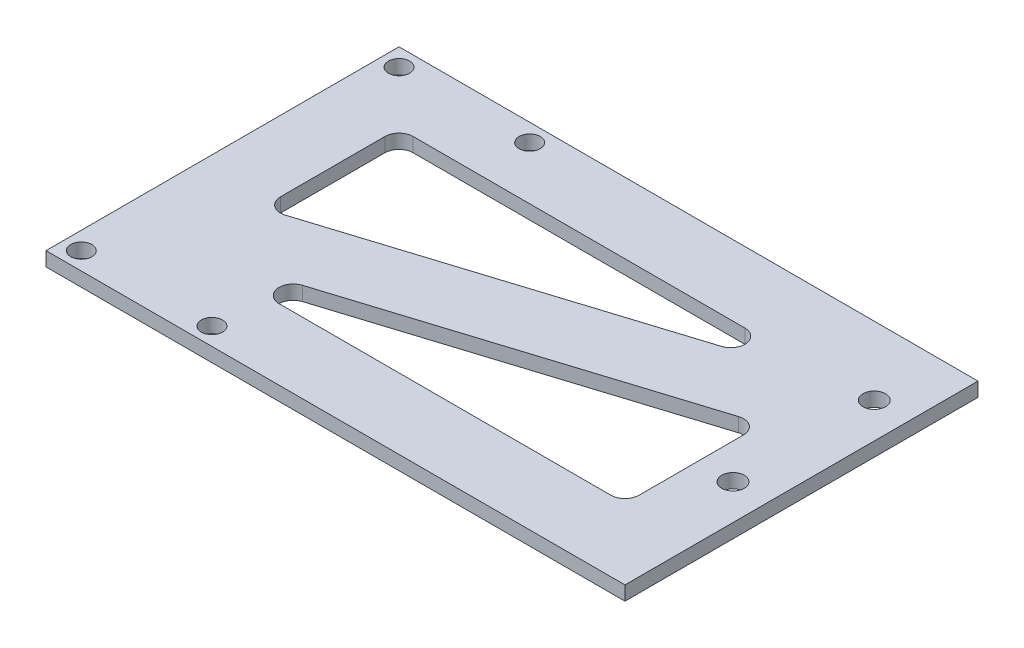
ISO-10303-21;
HEADER;
FILE_DESCRIPTION(('STEP AP214'),'2;1');
FILE_NAME('part.step','',(''),(''),'','','');
FILE_SCHEMA(('AUTOMOTIVE_DESIGN { 1 0 10303 214 1 1 1 1 }'));
ENDSEC;
DATA;
#1=APPLICATION_CONTEXT('core data for automotive mechanical design processes');
#2=APPLICATION_PROTOCOL_DEFINITION('international standard','automotive_design',2000,#1);
#3=PRODUCT_CONTEXT('',#1,'mechanical');
#4=PRODUCT('Part','Part','',(#3));
#5=PRODUCT_RELATED_PRODUCT_CATEGORY('part','',(#4));
#6=PRODUCT_DEFINITION_FORMATION('','',#4);
#7=PRODUCT_DEFINITION_CONTEXT('part definition',#1,'design');
#8=PRODUCT_DEFINITION('design','',#6,#7);
#9=PRODUCT_DEFINITION_SHAPE('','',#8);
#10=(LENGTH_UNIT() NAMED_UNIT(*) SI_UNIT(.MILLI.,.METRE.));
#11=(NAMED_UNIT(*) PLANE_ANGLE_UNIT() SI_UNIT($,.RADIAN.));
#12=(NAMED_UNIT(*) SI_UNIT($,.STERADIAN.) SOLID_ANGLE_UNIT());
#13=UNCERTAINTY_MEASURE_WITH_UNIT(LENGTH_MEASURE(1.E-05),#10,'distance_accuracy_value','');
#14=(GEOMETRIC_REPRESENTATION_CONTEXT(3) GLOBAL_UNCERTAINTY_ASSIGNED_CONTEXT((#13)) GLOBAL_UNIT_ASSIGNED_CONTEXT((#10,
#11,#12)) REPRESENTATION_CONTEXT('',''));
#15=CARTESIAN_POINT('',(0.,0.,0.));
#16=DIRECTION('',(0.,0.,1.));
#17=DIRECTION('',(1.,0.,0.));
#18=AXIS2_PLACEMENT_3D('',#15,#16,#17);
#19=CARTESIAN_POINT('',(0.,2.,0.));
#20=DIRECTION('',(0.,-1.,0.));
#21=DIRECTION('',(0.,0.,-1.));
#22=AXIS2_PLACEMENT_3D('',#19,#20,#21);
#23=PLANE('',#22);
#24=DIRECTION('',(-1.,0.,0.));
#25=VECTOR('',#24,1.);
#26=CARTESIAN_POINT('',(10.,2.,-40.));
#27=LINE('',#26,#25);
#28=CARTESIAN_POINT('',(58.9853099850397,2.,-40.));
#29=VERTEX_POINT('',#28);
#30=CARTESIAN_POINT('',(12.,2.,-40.));
#31=VERTEX_POINT('',#30);
#32=EDGE_CURVE('E386',#29,#31,#27,.T.);
#33=ORIENTED_EDGE('',*,*,#32,.F.);
#34=CARTESIAN_POINT('',(58.9853099850397,2.,-38.));
#35=DIRECTION('',(0.,-1.,0.));
#36=DIRECTION('',(0.,0.,-1.));
#37=AXIS2_PLACEMENT_3D('',#34,#35,#36);
#38=CIRCLE('',#37,2.);
#39=CARTESIAN_POINT('',(59.5858188402202,2.,-36.0922816992937));
#40=VERTEX_POINT('',#39);
#41=EDGE_CURVE('E220',#29,#40,#38,.T.);
#42=ORIENTED_EDGE('',*,*,#41,.T.);
#43=DIRECTION('',(0.953859150353162,0.,-0.30025442759024));
#44=VECTOR('',#43,1.);
#45=CARTESIAN_POINT('',(72.,2.,-40.));
#46=LINE('',#45,#44);
#47=CARTESIAN_POINT('',(12.6005088551805,2.,-21.3023126042917));
#48=VERTEX_POINT('',#47);
#49=EDGE_CURVE('E246',#48,#40,#46,.T.);
#50=ORIENTED_EDGE('',*,*,#49,.F.);
#51=CARTESIAN_POINT('',(12.,2.,-23.2100309049981));
#52=DIRECTION('',(0.,-1.,0.));
#53=DIRECTION('',(0.,0.,-1.));
#54=AXIS2_PLACEMENT_3D('',#51,#52,#53);
#55=CIRCLE('',#54,2.);
#56=CARTESIAN_POINT('',(10.,2.,-23.2100309049981));
#57=VERTEX_POINT('',#56);
#58=EDGE_CURVE('E222',#48,#57,#55,.T.);
#59=ORIENTED_EDGE('',*,*,#58,.T.);
#60=DIRECTION('',(0.,0.,1.));
#61=VECTOR('',#60,1.);
#62=CARTESIAN_POINT('',(10.,2.,-20.4837281230646));
#63=LINE('',#62,#61);
#64=CARTESIAN_POINT('',(10.,2.,-38.));
#65=VERTEX_POINT('',#64);
#66=EDGE_CURVE('E403',#65,#57,#63,.T.);
#67=ORIENTED_EDGE('',*,*,#66,.F.);
#68=CARTESIAN_POINT('',(12.,2.,-38.));
#69=DIRECTION('',(0.,-1.,0.));
#70=DIRECTION('',(0.,0.,-1.));
#71=AXIS2_PLACEMENT_3D('',#68,#69,#70);
#72=CIRCLE('',#71,2.);
#73=EDGE_CURVE('E213',#65,#31,#72,.T.);
#74=ORIENTED_EDGE('',*,*,#73,.T.);
#75=EDGE_LOOP('',(#33,#42,#50,#59,#67,#74));
#76=FACE_BOUND('',#75,.T.);
#77=DIRECTION('',(1.,0.,0.));
#78=VECTOR('',#77,1.);
#79=CARTESIAN_POINT('',(10.,2.,-10.));
#80=LINE('',#79,#78);
#81=CARTESIAN_POINT('',(23.0146900149604,2.,-10.));
#82=VERTEX_POINT('',#81);
#83=CARTESIAN_POINT('',(70.,2.,-10.));
#84=VERTEX_POINT('',#83);
#85=EDGE_CURVE('E236',#82,#84,#80,.T.);
#86=ORIENTED_EDGE('',*,*,#85,.F.);
#87=CARTESIAN_POINT('',(23.0146900149604,2.,-12.));
#88=DIRECTION('',(0.,-1.,0.));
#89=DIRECTION('',(0.,0.,-1.));
#90=AXIS2_PLACEMENT_3D('',#87,#88,#89);
#91=CIRCLE('',#90,2.);
#92=CARTESIAN_POINT('',(22.4141811597799,2.,-13.9077183007063));
#93=VERTEX_POINT('',#92);
#94=EDGE_CURVE('E47',#82,#93,#91,.T.);
#95=ORIENTED_EDGE('',*,*,#94,.T.);
#96=DIRECTION('',(-0.953859150353162,0.,0.30025442759024));
#97=VECTOR('',#96,1.);
#98=CARTESIAN_POINT('',(72.,2.,-29.5162718769354));
#99=LINE('',#98,#97);
#100=CARTESIAN_POINT('',(69.3994911448195,2.,-28.6976873957083));
#101=VERTEX_POINT('',#100);
#102=EDGE_CURVE('E240',#101,#93,#99,.T.);
#103=ORIENTED_EDGE('',*,*,#102,.F.);
#104=CARTESIAN_POINT('',(70.,2.,-26.7899690950019));
#105=DIRECTION('',(0.,-1.,0.));
#106=DIRECTION('',(0.,0.,-1.));
#107=AXIS2_PLACEMENT_3D('',#104,#105,#106);
#108=CIRCLE('',#107,2.);
#109=CARTESIAN_POINT('',(72.,2.,-26.7899690950019));
#110=VERTEX_POINT('',#109);
#111=EDGE_CURVE('E223',#101,#110,#108,.T.);
#112=ORIENTED_EDGE('',*,*,#111,.T.);
#113=DIRECTION('',(0.,0.,-1.));
#114=VECTOR('',#113,1.);
#115=CARTESIAN_POINT('',(72.,2.,-10.));
#116=LINE('',#115,#114);
#117=CARTESIAN_POINT('',(72.,2.,-12.));
#118=VERTEX_POINT('',#117);
#119=EDGE_CURVE('E260',#118,#110,#116,.T.);
#120=ORIENTED_EDGE('',*,*,#119,.F.);
#121=CARTESIAN_POINT('',(70.,2.,-12.));
#122=DIRECTION('',(0.,-1.,0.));
#123=DIRECTION('',(0.,0.,-1.));
#124=AXIS2_PLACEMENT_3D('',#121,#122,#123);
#125=CIRCLE('',#124,2.);
#126=EDGE_CURVE('E227',#118,#84,#125,.T.);
#127=ORIENTED_EDGE('',*,*,#126,.T.);
#128=EDGE_LOOP('',(#86,#95,#103,#112,#120,#127));
#129=FACE_BOUND('',#128,.T.);
#130=CARTESIAN_POINT('',(77.,2.,-20.3));
#131=DIRECTION('',(0.,1.,0.));
#132=DIRECTION('',(0.,0.,1.));
#133=AXIS2_PLACEMENT_3D('',#130,#131,#132);
#134=CIRCLE('',#133,1.6);
#135=CARTESIAN_POINT('',(77.,2.,-18.7));
#136=VERTEX_POINT('',#135);
#137=EDGE_CURVE('E268',#136,#136,#134,.T.);
#138=ORIENTED_EDGE('',*,*,#137,.F.);
#139=EDGE_LOOP('',(#138));
#140=FACE_BOUND('',#139,.T.);
#141=CARTESIAN_POINT('',(77.,2.,-40.3));
#142=DIRECTION('',(0.,1.,0.));
#143=DIRECTION('',(0.,0.,1.));
#144=AXIS2_PLACEMENT_3D('',#141,#142,#143);
#145=CIRCLE('',#144,1.60000000000001);
#146=CARTESIAN_POINT('',(77.,2.,-38.7));
#147=VERTEX_POINT('',#146);
#148=EDGE_CURVE('E271',#147,#147,#145,.T.);
#149=ORIENTED_EDGE('',*,*,#148,.F.);
#150=EDGE_LOOP('',(#149));
#151=FACE_BOUND('',#150,.T.);
#152=DIRECTION('',(0.,0.,1.));
#153=VECTOR('',#152,1.);
#154=CARTESIAN_POINT('',(0.,2.,0.));
#155=LINE('',#154,#153);
#156=CARTESIAN_POINT('',(0.,2.,-50.));
#157=VERTEX_POINT('',#156);
#158=CARTESIAN_POINT('',(0.,2.,0.));
#159=VERTEX_POINT('',#158);
#160=EDGE_CURVE('E164',#157,#159,#155,.T.);
#161=ORIENTED_EDGE('',*,*,#160,.T.);
#162=DIRECTION('',(1.,0.,0.));
#163=VECTOR('',#162,1.);
#164=CARTESIAN_POINT('',(0.,2.,0.));
#165=LINE('',#164,#163);
#166=CARTESIAN_POINT('',(82.,2.,0.));
#167=VERTEX_POINT('',#166);
#168=EDGE_CURVE('E152',#159,#167,#165,.T.);
#169=ORIENTED_EDGE('',*,*,#168,.T.);
#170=DIRECTION('',(0.,0.,-1.));
#171=VECTOR('',#170,1.);
#172=CARTESIAN_POINT('',(82.,2.,0.));
#173=LINE('',#172,#171);
#174=CARTESIAN_POINT('',(82.,2.,-50.));
#175=VERTEX_POINT('',#174);
#176=EDGE_CURVE('E163',#167,#175,#173,.T.);
#177=ORIENTED_EDGE('',*,*,#176,.T.);
#178=DIRECTION('',(-1.,0.,0.));
#179=VECTOR('',#178,1.);
#180=CARTESIAN_POINT('',(0.,2.,-50.));
#181=LINE('',#180,#179);
#182=EDGE_CURVE('E168',#175,#157,#181,.T.);
#183=ORIENTED_EDGE('',*,*,#182,.T.);
#184=EDGE_LOOP('',(#161,#169,#177,#183));
#185=FACE_BOUND('',#184,.T.);
#186=CARTESIAN_POINT('',(2.5,2.,-47.5));
#187=DIRECTION('',(0.,1.,0.));
#188=DIRECTION('',(0.,0.,1.));
#189=AXIS2_PLACEMENT_3D('',#186,#187,#188);
#190=CIRCLE('',#189,1.5);
#191=CARTESIAN_POINT('',(2.5,2.,-46.));
#192=VERTEX_POINT('',#191);
#193=EDGE_CURVE('E294',#192,#192,#190,.T.);
#194=ORIENTED_EDGE('',*,*,#193,.F.);
#195=EDGE_LOOP('',(#194));
#196=FACE_BOUND('',#195,.T.);
#197=CARTESIAN_POINT('',(2.5,2.,-2.5));
#198=DIRECTION('',(0.,1.,0.));
#199=DIRECTION('',(0.,0.,1.));
#200=AXIS2_PLACEMENT_3D('',#197,#198,#199);
#201=CIRCLE('',#200,1.5);
#202=CARTESIAN_POINT('',(2.5,2.,-0.999999999999994));
#203=VERTEX_POINT('',#202);
#204=EDGE_CURVE('E289',#203,#203,#201,.T.);
#205=ORIENTED_EDGE('',*,*,#204,.F.);
#206=EDGE_LOOP('',(#205));
#207=FACE_BOUND('',#206,.T.);
#208=CARTESIAN_POINT('',(21.,2.,-47.5));
#209=DIRECTION('',(0.,1.,0.));
#210=DIRECTION('',(0.,0.,1.));
#211=AXIS2_PLACEMENT_3D('',#208,#209,#210);
#212=CIRCLE('',#211,1.5);
#213=CARTESIAN_POINT('',(21.,2.,-46.));
#214=VERTEX_POINT('',#213);
#215=EDGE_CURVE('E285',#214,#214,#212,.T.);
#216=ORIENTED_EDGE('',*,*,#215,.F.);
#217=EDGE_LOOP('',(#216));
#218=FACE_BOUND('',#217,.T.);
#219=CARTESIAN_POINT('',(21.,2.,-2.5));
#220=DIRECTION('',(0.,1.,0.));
#221=DIRECTION('',(0.,0.,1.));
#222=AXIS2_PLACEMENT_3D('',#219,#220,#221);
#223=CIRCLE('',#222,1.5);
#224=CARTESIAN_POINT('',(21.,2.,-0.999999999999997));
#225=VERTEX_POINT('',#224);
#226=EDGE_CURVE('E277',#225,#225,#223,.T.);
#227=ORIENTED_EDGE('',*,*,#226,.F.);
#228=EDGE_LOOP('',(#227));
#229=FACE_BOUND('',#228,.T.);
#230=ADVANCED_FACE('F41',(#76,#129,#140,#151,#185,#196,#207,#218,#229),#23,.F.);
#231=CARTESIAN_POINT('',(0.,0.,0.));
#232=DIRECTION('',(0.,-1.,0.));
#233=DIRECTION('',(0.,0.,-1.));
#234=AXIS2_PLACEMENT_3D('',#231,#232,#233);
#235=PLANE('',#234);
#236=DIRECTION('',(0.,0.,1.));
#237=VECTOR('',#236,1.);
#238=CARTESIAN_POINT('',(10.,0.,-20.4837281230646));
#239=LINE('',#238,#237);
#240=CARTESIAN_POINT('',(10.,0.,-38.));
#241=VERTEX_POINT('',#240);
#242=CARTESIAN_POINT('',(10.,0.,-23.2100309049981));
#243=VERTEX_POINT('',#242);
#244=EDGE_CURVE('E401',#241,#243,#239,.T.);
#245=ORIENTED_EDGE('',*,*,#244,.T.);
#246=CARTESIAN_POINT('',(12.,0.,-23.2100309049981));
#247=DIRECTION('',(0.,-1.,0.));
#248=DIRECTION('',(0.,0.,-1.));
#249=AXIS2_PLACEMENT_3D('',#246,#247,#248);
#250=CIRCLE('',#249,2.);
#251=CARTESIAN_POINT('',(12.6005088551805,0.,-21.3023126042917));
#252=VERTEX_POINT('',#251);
#253=EDGE_CURVE('E224',#243,#252,#250,.F.);
#254=ORIENTED_EDGE('',*,*,#253,.T.);
#255=DIRECTION('',(0.953859150353162,0.,-0.30025442759024));
#256=VECTOR('',#255,1.);
#257=CARTESIAN_POINT('',(72.,0.,-40.));
#258=LINE('',#257,#256);
#259=CARTESIAN_POINT('',(59.5858188402202,0.,-36.0922816992937));
#260=VERTEX_POINT('',#259);
#261=EDGE_CURVE('E400',#252,#260,#258,.T.);
#262=ORIENTED_EDGE('',*,*,#261,.T.);
#263=CARTESIAN_POINT('',(58.9853099850397,0.,-38.));
#264=DIRECTION('',(0.,-1.,0.));
#265=DIRECTION('',(0.,0.,-1.));
#266=AXIS2_PLACEMENT_3D('',#263,#264,#265);
#267=CIRCLE('',#266,2.);
#268=CARTESIAN_POINT('',(58.9853099850397,0.,-40.));
#269=VERTEX_POINT('',#268);
#270=EDGE_CURVE('E218',#260,#269,#267,.F.);
#271=ORIENTED_EDGE('',*,*,#270,.T.);
#272=DIRECTION('',(-1.,0.,0.));
#273=VECTOR('',#272,1.);
#274=CARTESIAN_POINT('',(10.,0.,-40.));
#275=LINE('',#274,#273);
#276=CARTESIAN_POINT('',(12.,0.,-40.));
#277=VERTEX_POINT('',#276);
#278=EDGE_CURVE('E399',#269,#277,#275,.T.);
#279=ORIENTED_EDGE('',*,*,#278,.T.);
#280=CARTESIAN_POINT('',(12.,0.,-38.));
#281=DIRECTION('',(0.,-1.,0.));
#282=DIRECTION('',(0.,0.,-1.));
#283=AXIS2_PLACEMENT_3D('',#280,#281,#282);
#284=CIRCLE('',#283,2.);
#285=EDGE_CURVE('E214',#277,#241,#284,.F.);
#286=ORIENTED_EDGE('',*,*,#285,.T.);
#287=EDGE_LOOP('',(#245,#254,#262,#271,#279,#286));
#288=FACE_BOUND('',#287,.T.);
#289=DIRECTION('',(0.,0.,-1.));
#290=VECTOR('',#289,1.);
#291=CARTESIAN_POINT('',(72.,0.,-10.));
#292=LINE('',#291,#290);
#293=CARTESIAN_POINT('',(72.,0.,-12.));
#294=VERTEX_POINT('',#293);
#295=CARTESIAN_POINT('',(72.,0.,-26.7899690950019));
#296=VERTEX_POINT('',#295);
#297=EDGE_CURVE('E253',#294,#296,#292,.T.);
#298=ORIENTED_EDGE('',*,*,#297,.T.);
#299=CARTESIAN_POINT('',(70.,0.,-26.7899690950019));
#300=DIRECTION('',(0.,-1.,0.));
#301=DIRECTION('',(0.,0.,-1.));
#302=AXIS2_PLACEMENT_3D('',#299,#300,#301);
#303=CIRCLE('',#302,2.);
#304=CARTESIAN_POINT('',(69.3994911448195,0.,-28.6976873957083));
#305=VERTEX_POINT('',#304);
#306=EDGE_CURVE('E230',#296,#305,#303,.F.);
#307=ORIENTED_EDGE('',*,*,#306,.T.);
#308=DIRECTION('',(-0.953859150353162,0.,0.30025442759024));
#309=VECTOR('',#308,1.);
#310=CARTESIAN_POINT('',(72.,0.,-29.5162718769354));
#311=LINE('',#310,#309);
#312=CARTESIAN_POINT('',(22.4141811597799,0.,-13.9077183007063));
#313=VERTEX_POINT('',#312);
#314=EDGE_CURVE('E252',#305,#313,#311,.T.);
#315=ORIENTED_EDGE('',*,*,#314,.T.);
#316=CARTESIAN_POINT('',(23.0146900149604,0.,-12.));
#317=DIRECTION('',(0.,-1.,0.));
#318=DIRECTION('',(0.,0.,-1.));
#319=AXIS2_PLACEMENT_3D('',#316,#317,#318);
#320=CIRCLE('',#319,2.);
#321=CARTESIAN_POINT('',(23.0146900149604,0.,-10.));
#322=VERTEX_POINT('',#321);
#323=EDGE_CURVE('E11',#313,#322,#320,.F.);
#324=ORIENTED_EDGE('',*,*,#323,.T.);
#325=DIRECTION('',(1.,0.,0.));
#326=VECTOR('',#325,1.);
#327=CARTESIAN_POINT('',(10.,0.,-10.));
#328=LINE('',#327,#326);
#329=CARTESIAN_POINT('',(70.,0.,-10.));
#330=VERTEX_POINT('',#329);
#331=EDGE_CURVE('E248',#322,#330,#328,.T.);
#332=ORIENTED_EDGE('',*,*,#331,.T.);
#333=CARTESIAN_POINT('',(70.,0.,-12.));
#334=DIRECTION('',(0.,-1.,0.));
#335=DIRECTION('',(0.,0.,-1.));
#336=AXIS2_PLACEMENT_3D('',#333,#334,#335);
#337=CIRCLE('',#336,2.);
#338=EDGE_CURVE('E231',#330,#294,#337,.F.);
#339=ORIENTED_EDGE('',*,*,#338,.T.);
#340=EDGE_LOOP('',(#298,#307,#315,#324,#332,#339));
#341=FACE_BOUND('',#340,.T.);
#342=CARTESIAN_POINT('',(77.,0.,-20.3));
#343=DIRECTION('',(0.,1.,0.));
#344=DIRECTION('',(0.,0.,1.));
#345=AXIS2_PLACEMENT_3D('',#342,#343,#344);
#346=CIRCLE('',#345,1.6);
#347=CARTESIAN_POINT('',(77.,0.,-18.7));
#348=VERTEX_POINT('',#347);
#349=EDGE_CURVE('E262',#348,#348,#346,.T.);
#350=ORIENTED_EDGE('',*,*,#349,.T.);
#351=EDGE_LOOP('',(#350));
#352=FACE_BOUND('',#351,.T.);
#353=CARTESIAN_POINT('',(77.,0.,-40.3));
#354=DIRECTION('',(0.,1.,0.));
#355=DIRECTION('',(0.,0.,1.));
#356=AXIS2_PLACEMENT_3D('',#353,#354,#355);
#357=CIRCLE('',#356,1.60000000000001);
#358=CARTESIAN_POINT('',(77.,0.,-38.7));
#359=VERTEX_POINT('',#358);
#360=EDGE_CURVE('E254',#359,#359,#357,.T.);
#361=ORIENTED_EDGE('',*,*,#360,.T.);
#362=EDGE_LOOP('',(#361));
#363=FACE_BOUND('',#362,.T.);
#364=CARTESIAN_POINT('',(21.,0.,-47.5));
#365=DIRECTION('',(0.,1.,0.));
#366=DIRECTION('',(0.,0.,1.));
#367=AXIS2_PLACEMENT_3D('',#364,#365,#366);
#368=CIRCLE('',#367,1.5);
#369=CARTESIAN_POINT('',(21.,0.,-46.));
#370=VERTEX_POINT('',#369);
#371=EDGE_CURVE('E276',#370,#370,#368,.T.);
#372=ORIENTED_EDGE('',*,*,#371,.T.);
#373=EDGE_LOOP('',(#372));
#374=FACE_BOUND('',#373,.T.);
#375=CARTESIAN_POINT('',(2.5,0.,-47.5));
#376=DIRECTION('',(0.,1.,0.));
#377=DIRECTION('',(0.,0.,1.));
#378=AXIS2_PLACEMENT_3D('',#375,#376,#377);
#379=CIRCLE('',#378,1.5);
#380=CARTESIAN_POINT('',(2.5,0.,-46.));
#381=VERTEX_POINT('',#380);
#382=EDGE_CURVE('E292',#381,#381,#379,.T.);
#383=ORIENTED_EDGE('',*,*,#382,.T.);
#384=EDGE_LOOP('',(#383));
#385=FACE_BOUND('',#384,.T.);
#386=DIRECTION('',(0.,0.,1.));
#387=VECTOR('',#386,1.);
#388=CARTESIAN_POINT('',(0.,0.,0.));
#389=LINE('',#388,#387);
#390=CARTESIAN_POINT('',(0.,0.,-50.));
#391=VERTEX_POINT('',#390);
#392=CARTESIAN_POINT('',(0.,0.,0.));
#393=VERTEX_POINT('',#392);
#394=EDGE_CURVE('E179',#391,#393,#389,.T.);
#395=ORIENTED_EDGE('',*,*,#394,.F.);
#396=DIRECTION('',(-1.,0.,0.));
#397=VECTOR('',#396,1.);
#398=CARTESIAN_POINT('',(0.,0.,-50.));
#399=LINE('',#398,#397);
#400=CARTESIAN_POINT('',(82.,0.,-50.));
#401=VERTEX_POINT('',#400);
#402=EDGE_CURVE('E172',#401,#391,#399,.T.);
#403=ORIENTED_EDGE('',*,*,#402,.F.);
#404=DIRECTION('',(0.,0.,-1.));
#405=VECTOR('',#404,1.);
#406=CARTESIAN_POINT('',(82.,0.,0.));
#407=LINE('',#406,#405);
#408=CARTESIAN_POINT('',(82.,0.,0.));
#409=VERTEX_POINT('',#408);
#410=EDGE_CURVE('E305',#409,#401,#407,.T.);
#411=ORIENTED_EDGE('',*,*,#410,.F.);
#412=DIRECTION('',(1.,0.,0.));
#413=VECTOR('',#412,1.);
#414=CARTESIAN_POINT('',(0.,0.,0.));
#415=LINE('',#414,#413);
#416=EDGE_CURVE('E304',#393,#409,#415,.T.);
#417=ORIENTED_EDGE('',*,*,#416,.F.);
#418=EDGE_LOOP('',(#395,#403,#411,#417));
#419=FACE_BOUND('',#418,.T.);
#420=CARTESIAN_POINT('',(2.5,0.,-2.5));
#421=DIRECTION('',(0.,1.,0.));
#422=DIRECTION('',(0.,0.,1.));
#423=AXIS2_PLACEMENT_3D('',#420,#421,#422);
#424=CIRCLE('',#423,1.5);
#425=CARTESIAN_POINT('',(2.5,0.,-0.999999999999994));
#426=VERTEX_POINT('',#425);
#427=EDGE_CURVE('E284',#426,#426,#424,.T.);
#428=ORIENTED_EDGE('',*,*,#427,.T.);
#429=EDGE_LOOP('',(#428));
#430=FACE_BOUND('',#429,.T.);
#431=CARTESIAN_POINT('',(21.,0.,-2.5));
#432=DIRECTION('',(0.,1.,0.));
#433=DIRECTION('',(0.,0.,1.));
#434=AXIS2_PLACEMENT_3D('',#431,#432,#433);
#435=CIRCLE('',#434,1.5);
#436=CARTESIAN_POINT('',(21.,0.,-0.999999999999997));
#437=VERTEX_POINT('',#436);
#438=EDGE_CURVE('E270',#437,#437,#435,.T.);
#439=ORIENTED_EDGE('',*,*,#438,.T.);
#440=EDGE_LOOP('',(#439));
#441=FACE_BOUND('',#440,.T.);
#442=ADVANCED_FACE('F316',(#288,#341,#352,#363,#374,#385,#419,#430,#441),#235,.T.);
#443=CARTESIAN_POINT('',(0.,2.,0.));
#444=DIRECTION('',(1.,0.,0.));
#445=DIRECTION('',(0.,0.,-1.));
#446=AXIS2_PLACEMENT_3D('',#443,#444,#445);
#447=PLANE('',#446);
#448=ORIENTED_EDGE('',*,*,#394,.T.);
#449=DIRECTION('',(0.,-1.,0.));
#450=VECTOR('',#449,1.);
#451=CARTESIAN_POINT('',(0.,2.,0.));
#452=LINE('',#451,#450);
#453=EDGE_CURVE('E158',#159,#393,#452,.T.);
#454=ORIENTED_EDGE('',*,*,#453,.F.);
#455=ORIENTED_EDGE('',*,*,#160,.F.);
#456=DIRECTION('',(0.,-1.,0.));
#457=VECTOR('',#456,1.);
#458=CARTESIAN_POINT('',(0.,2.,-50.));
#459=LINE('',#458,#457);
#460=EDGE_CURVE('E301',#157,#391,#459,.T.);
#461=ORIENTED_EDGE('',*,*,#460,.T.);
#462=EDGE_LOOP('',(#448,#454,#455,#461));
#463=FACE_BOUND('',#462,.T.);
#464=ADVANCED_FACE('F176',(#463),#447,.F.);
#465=CARTESIAN_POINT('',(0.,2.,0.));
#466=DIRECTION('',(0.,0.,-1.));
#467=DIRECTION('',(-1.,0.,0.));
#468=AXIS2_PLACEMENT_3D('',#465,#466,#467);
#469=PLANE('',#468);
#470=ORIENTED_EDGE('',*,*,#416,.T.);
#471=DIRECTION('',(0.,-1.,0.));
#472=VECTOR('',#471,1.);
#473=CARTESIAN_POINT('',(82.,2.,0.));
#474=LINE('',#473,#472);
#475=EDGE_CURVE('E161',#167,#409,#474,.T.);
#476=ORIENTED_EDGE('',*,*,#475,.F.);
#477=ORIENTED_EDGE('',*,*,#168,.F.);
#478=ORIENTED_EDGE('',*,*,#453,.T.);
#479=EDGE_LOOP('',(#470,#476,#477,#478));
#480=FACE_BOUND('',#479,.T.);
#481=ADVANCED_FACE('F156',(#480),#469,.F.);
#482=CARTESIAN_POINT('',(82.,2.,0.));
#483=DIRECTION('',(-1.,0.,0.));
#484=DIRECTION('',(0.,0.,1.));
#485=AXIS2_PLACEMENT_3D('',#482,#483,#484);
#486=PLANE('',#485);
#487=ORIENTED_EDGE('',*,*,#410,.T.);
#488=DIRECTION('',(0.,-1.,0.));
#489=VECTOR('',#488,1.);
#490=CARTESIAN_POINT('',(82.,2.,-50.));
#491=LINE('',#490,#489);
#492=EDGE_CURVE('E181',#175,#401,#491,.T.);
#493=ORIENTED_EDGE('',*,*,#492,.F.);
#494=ORIENTED_EDGE('',*,*,#176,.F.);
#495=ORIENTED_EDGE('',*,*,#475,.T.);
#496=EDGE_LOOP('',(#487,#493,#494,#495));
#497=FACE_BOUND('',#496,.T.);
#498=ADVANCED_FACE('F318',(#497),#486,.F.);
#499=CARTESIAN_POINT('',(0.,2.,-50.));
#500=DIRECTION('',(0.,0.,1.));
#501=DIRECTION('',(1.,0.,0.));
#502=AXIS2_PLACEMENT_3D('',#499,#500,#501);
#503=PLANE('',#502);
#504=ORIENTED_EDGE('',*,*,#402,.T.);
#505=ORIENTED_EDGE('',*,*,#460,.F.);
#506=ORIENTED_EDGE('',*,*,#182,.F.);
#507=ORIENTED_EDGE('',*,*,#492,.T.);
#508=EDGE_LOOP('',(#504,#505,#506,#507));
#509=FACE_BOUND('',#508,.T.);
#510=ADVANCED_FACE('F315',(#509),#503,.F.);
#511=CARTESIAN_POINT('',(2.5,2.,-47.5));
#512=DIRECTION('',(0.,-1.,0.));
#513=DIRECTION('',(0.,0.,-1.));
#514=AXIS2_PLACEMENT_3D('',#511,#512,#513);
#515=CYLINDRICAL_SURFACE('',#514,1.5);
#516=ORIENTED_EDGE('',*,*,#193,.T.);
#517=EDGE_LOOP('',(#516));
#518=FACE_BOUND('',#517,.T.);
#519=ORIENTED_EDGE('',*,*,#382,.F.);
#520=EDGE_LOOP('',(#519));
#521=FACE_BOUND('',#520,.T.);
#522=ADVANCED_FACE('F324',(#518,#521),#515,.F.);
#523=CARTESIAN_POINT('',(2.5,2.,-2.5));
#524=DIRECTION('',(0.,-1.,0.));
#525=DIRECTION('',(0.,0.,-1.));
#526=AXIS2_PLACEMENT_3D('',#523,#524,#525);
#527=CYLINDRICAL_SURFACE('',#526,1.5);
#528=ORIENTED_EDGE('',*,*,#204,.T.);
#529=EDGE_LOOP('',(#528));
#530=FACE_BOUND('',#529,.T.);
#531=ORIENTED_EDGE('',*,*,#427,.F.);
#532=EDGE_LOOP('',(#531));
#533=FACE_BOUND('',#532,.T.);
#534=ADVANCED_FACE('F341',(#530,#533),#527,.F.);
#535=CARTESIAN_POINT('',(21.,2.,-47.5));
#536=DIRECTION('',(0.,-1.,0.));
#537=DIRECTION('',(0.,0.,-1.));
#538=AXIS2_PLACEMENT_3D('',#535,#536,#537);
#539=CYLINDRICAL_SURFACE('',#538,1.5);
#540=ORIENTED_EDGE('',*,*,#215,.T.);
#541=EDGE_LOOP('',(#540));
#542=FACE_BOUND('',#541,.T.);
#543=ORIENTED_EDGE('',*,*,#371,.F.);
#544=EDGE_LOOP('',(#543));
#545=FACE_BOUND('',#544,.T.);
#546=ADVANCED_FACE('F345',(#542,#545),#539,.F.);
#547=CARTESIAN_POINT('',(21.,2.,-2.5));
#548=DIRECTION('',(0.,-1.,0.));
#549=DIRECTION('',(0.,0.,-1.));
#550=AXIS2_PLACEMENT_3D('',#547,#548,#549);
#551=CYLINDRICAL_SURFACE('',#550,1.5);
#552=ORIENTED_EDGE('',*,*,#226,.T.);
#553=EDGE_LOOP('',(#552));
#554=FACE_BOUND('',#553,.T.);
#555=ORIENTED_EDGE('',*,*,#438,.F.);
#556=EDGE_LOOP('',(#555));
#557=FACE_BOUND('',#556,.T.);
#558=ADVANCED_FACE('F349',(#554,#557),#551,.F.);
#559=CARTESIAN_POINT('',(77.,0.,-40.3));
#560=DIRECTION('',(0.,1.,0.));
#561=DIRECTION('',(0.,0.,1.));
#562=AXIS2_PLACEMENT_3D('',#559,#560,#561);
#563=CYLINDRICAL_SURFACE('',#562,1.60000000000001);
#564=ORIENTED_EDGE('',*,*,#360,.F.);
#565=EDGE_LOOP('',(#564));
#566=FACE_BOUND('',#565,.T.);
#567=ORIENTED_EDGE('',*,*,#148,.T.);
#568=EDGE_LOOP('',(#567));
#569=FACE_BOUND('',#568,.T.);
#570=ADVANCED_FACE('F351',(#566,#569),#563,.F.);
#571=CARTESIAN_POINT('',(77.,0.,-20.3));
#572=DIRECTION('',(0.,1.,0.));
#573=DIRECTION('',(0.,0.,1.));
#574=AXIS2_PLACEMENT_3D('',#571,#572,#573);
#575=CYLINDRICAL_SURFACE('',#574,1.6);
#576=ORIENTED_EDGE('',*,*,#349,.F.);
#577=EDGE_LOOP('',(#576));
#578=FACE_BOUND('',#577,.T.);
#579=ORIENTED_EDGE('',*,*,#137,.T.);
#580=EDGE_LOOP('',(#579));
#581=FACE_BOUND('',#580,.T.);
#582=ADVANCED_FACE('F357',(#578,#581),#575,.F.);
#583=CARTESIAN_POINT('',(72.,0.,-29.5162718769354));
#584=DIRECTION('',(-0.30025442759024,0.,-0.953859150353163));
#585=DIRECTION('',(-0.953859150353163,0.,0.30025442759024));
#586=AXIS2_PLACEMENT_3D('',#583,#584,#585);
#587=PLANE('',#586);
#588=ORIENTED_EDGE('',*,*,#314,.F.);
#589=DIRECTION('',(0.,1.,0.));
#590=VECTOR('',#589,1.);
#591=CARTESIAN_POINT('',(69.3994911448195,2.,-28.6976873957083));
#592=LINE('',#591,#590);
#593=EDGE_CURVE('E203',#305,#101,#592,.T.);
#594=ORIENTED_EDGE('',*,*,#593,.T.);
#595=ORIENTED_EDGE('',*,*,#102,.T.);
#596=DIRECTION('',(0.,1.,0.));
#597=VECTOR('',#596,1.);
#598=CARTESIAN_POINT('',(22.4141811597799,0.,-13.9077183007063));
#599=LINE('',#598,#597);
#600=EDGE_CURVE('E200',#93,#313,#599,.F.);
#601=ORIENTED_EDGE('',*,*,#600,.T.);
#602=EDGE_LOOP('',(#588,#594,#595,#601));
#603=FACE_BOUND('',#602,.T.);
#604=ADVANCED_FACE('F242',(#603),#587,.F.);
#605=CARTESIAN_POINT('',(72.,0.,-10.));
#606=DIRECTION('',(1.,0.,0.));
#607=DIRECTION('',(0.,0.,-1.));
#608=AXIS2_PLACEMENT_3D('',#605,#606,#607);
#609=PLANE('',#608);
#610=ORIENTED_EDGE('',*,*,#119,.T.);
#611=DIRECTION('',(0.,1.,0.));
#612=VECTOR('',#611,1.);
#613=CARTESIAN_POINT('',(72.,0.,-26.7899690950019));
#614=LINE('',#613,#612);
#615=EDGE_CURVE('E210',#110,#296,#614,.F.);
#616=ORIENTED_EDGE('',*,*,#615,.T.);
#617=ORIENTED_EDGE('',*,*,#297,.F.);
#618=DIRECTION('',(0.,1.,0.));
#619=VECTOR('',#618,1.);
#620=CARTESIAN_POINT('',(72.,2.,-12.));
#621=LINE('',#620,#619);
#622=EDGE_CURVE('E204',#294,#118,#621,.T.);
#623=ORIENTED_EDGE('',*,*,#622,.T.);
#624=EDGE_LOOP('',(#610,#616,#617,#623));
#625=FACE_BOUND('',#624,.T.);
#626=ADVANCED_FACE('F361',(#625),#609,.F.);
#627=CARTESIAN_POINT('',(10.,0.,-10.));
#628=DIRECTION('',(0.,0.,1.));
#629=DIRECTION('',(1.,0.,0.));
#630=AXIS2_PLACEMENT_3D('',#627,#628,#629);
#631=PLANE('',#630);
#632=ORIENTED_EDGE('',*,*,#85,.T.);
#633=DIRECTION('',(0.,1.,0.));
#634=VECTOR('',#633,1.);
#635=CARTESIAN_POINT('',(70.,0.,-10.));
#636=LINE('',#635,#634);
#637=EDGE_CURVE('E57',#84,#330,#636,.F.);
#638=ORIENTED_EDGE('',*,*,#637,.T.);
#639=ORIENTED_EDGE('',*,*,#331,.F.);
#640=DIRECTION('',(0.,1.,0.));
#641=VECTOR('',#640,1.);
#642=CARTESIAN_POINT('',(23.0146900149604,2.,-10.));
#643=LINE('',#642,#641);
#644=EDGE_CURVE('E207',#322,#82,#643,.T.);
#645=ORIENTED_EDGE('',*,*,#644,.T.);
#646=EDGE_LOOP('',(#632,#638,#639,#645));
#647=FACE_BOUND('',#646,.T.);
#648=ADVANCED_FACE('F249',(#647),#631,.F.);
#649=CARTESIAN_POINT('',(72.,0.,-40.));
#650=DIRECTION('',(0.30025442759024,0.,0.953859150353163));
#651=DIRECTION('',(0.953859150353163,0.,-0.30025442759024));
#652=AXIS2_PLACEMENT_3D('',#649,#650,#651);
#653=PLANE('',#652);
#654=ORIENTED_EDGE('',*,*,#49,.T.);
#655=DIRECTION('',(0.,1.,0.));
#656=VECTOR('',#655,1.);
#657=CARTESIAN_POINT('',(59.5858188402202,0.,-36.0922816992937));
#658=LINE('',#657,#656);
#659=EDGE_CURVE('E197',#40,#260,#658,.F.);
#660=ORIENTED_EDGE('',*,*,#659,.T.);
#661=ORIENTED_EDGE('',*,*,#261,.F.);
#662=DIRECTION('',(0.,1.,0.));
#663=VECTOR('',#662,1.);
#664=CARTESIAN_POINT('',(12.6005088551805,2.,-21.3023126042917));
#665=LINE('',#664,#663);
#666=EDGE_CURVE('E193',#252,#48,#665,.T.);
#667=ORIENTED_EDGE('',*,*,#666,.T.);
#668=EDGE_LOOP('',(#654,#660,#661,#667));
#669=FACE_BOUND('',#668,.T.);
#670=ADVANCED_FACE('F368',(#669),#653,.F.);
#671=CARTESIAN_POINT('',(10.,0.,-20.4837281230646));
#672=DIRECTION('',(-1.,0.,0.));
#673=DIRECTION('',(0.,0.,1.));
#674=AXIS2_PLACEMENT_3D('',#671,#672,#673);
#675=PLANE('',#674);
#676=ORIENTED_EDGE('',*,*,#244,.F.);
#677=DIRECTION('',(0.,1.,0.));
#678=VECTOR('',#677,1.);
#679=CARTESIAN_POINT('',(10.,2.,-38.));
#680=LINE('',#679,#678);
#681=EDGE_CURVE('E182',#241,#65,#680,.T.);
#682=ORIENTED_EDGE('',*,*,#681,.T.);
#683=ORIENTED_EDGE('',*,*,#66,.T.);
#684=DIRECTION('',(0.,1.,0.));
#685=VECTOR('',#684,1.);
#686=CARTESIAN_POINT('',(10.,0.,-23.2100309049981));
#687=LINE('',#686,#685);
#688=EDGE_CURVE('E178',#57,#243,#687,.F.);
#689=ORIENTED_EDGE('',*,*,#688,.T.);
#690=EDGE_LOOP('',(#676,#682,#683,#689));
#691=FACE_BOUND('',#690,.T.);
#692=ADVANCED_FACE('F367',(#691),#675,.F.);
#693=CARTESIAN_POINT('',(10.,0.,-40.));
#694=DIRECTION('',(0.,0.,-1.));
#695=DIRECTION('',(-1.,0.,0.));
#696=AXIS2_PLACEMENT_3D('',#693,#694,#695);
#697=PLANE('',#696);
#698=ORIENTED_EDGE('',*,*,#32,.T.);
#699=DIRECTION('',(0.,1.,0.));
#700=VECTOR('',#699,1.);
#701=CARTESIAN_POINT('',(12.,0.,-40.));
#702=LINE('',#701,#700);
#703=EDGE_CURVE('E192',#31,#277,#702,.F.);
#704=ORIENTED_EDGE('',*,*,#703,.T.);
#705=ORIENTED_EDGE('',*,*,#278,.F.);
#706=DIRECTION('',(0.,1.,0.));
#707=VECTOR('',#706,1.);
#708=CARTESIAN_POINT('',(58.9853099850397,2.,-40.));
#709=LINE('',#708,#707);
#710=EDGE_CURVE('E187',#269,#29,#709,.T.);
#711=ORIENTED_EDGE('',*,*,#710,.T.);
#712=EDGE_LOOP('',(#698,#704,#705,#711));
#713=FACE_BOUND('',#712,.T.);
#714=ADVANCED_FACE('F373',(#713),#697,.F.);
#715=CARTESIAN_POINT('',(12.,0.,-38.));
#716=DIRECTION('',(0.,-1.,0.));
#717=DIRECTION('',(0.,0.,-1.));
#718=AXIS2_PLACEMENT_3D('',#715,#716,#717);
#719=CYLINDRICAL_SURFACE('',#718,2.);
#720=ORIENTED_EDGE('',*,*,#285,.F.);
#721=ORIENTED_EDGE('',*,*,#703,.F.);
#722=ORIENTED_EDGE('',*,*,#73,.F.);
#723=ORIENTED_EDGE('',*,*,#681,.F.);
#724=EDGE_LOOP('',(#720,#721,#722,#723));
#725=FACE_BOUND('',#724,.T.);
#726=ADVANCED_FACE('F380',(#725),#719,.F.);
#727=CARTESIAN_POINT('',(58.9853099850397,0.,-38.));
#728=DIRECTION('',(0.,-1.,0.));
#729=DIRECTION('',(0.,0.,-1.));
#730=AXIS2_PLACEMENT_3D('',#727,#728,#729);
#731=CYLINDRICAL_SURFACE('',#730,2.);
#732=ORIENTED_EDGE('',*,*,#270,.F.);
#733=ORIENTED_EDGE('',*,*,#659,.F.);
#734=ORIENTED_EDGE('',*,*,#41,.F.);
#735=ORIENTED_EDGE('',*,*,#710,.F.);
#736=EDGE_LOOP('',(#732,#733,#734,#735));
#737=FACE_BOUND('',#736,.T.);
#738=ADVANCED_FACE('F391',(#737),#731,.F.);
#739=CARTESIAN_POINT('',(12.,0.,-23.2100309049981));
#740=DIRECTION('',(0.,-1.,0.));
#741=DIRECTION('',(0.,0.,-1.));
#742=AXIS2_PLACEMENT_3D('',#739,#740,#741);
#743=CYLINDRICAL_SURFACE('',#742,2.);
#744=ORIENTED_EDGE('',*,*,#253,.F.);
#745=ORIENTED_EDGE('',*,*,#688,.F.);
#746=ORIENTED_EDGE('',*,*,#58,.F.);
#747=ORIENTED_EDGE('',*,*,#666,.F.);
#748=EDGE_LOOP('',(#744,#745,#746,#747));
#749=FACE_BOUND('',#748,.T.);
#750=ADVANCED_FACE('F418',(#749),#743,.F.);
#751=CARTESIAN_POINT('',(70.,0.,-26.7899690950019));
#752=DIRECTION('',(0.,-1.,0.));
#753=DIRECTION('',(0.,0.,-1.));
#754=AXIS2_PLACEMENT_3D('',#751,#752,#753);
#755=CYLINDRICAL_SURFACE('',#754,2.);
#756=ORIENTED_EDGE('',*,*,#306,.F.);
#757=ORIENTED_EDGE('',*,*,#615,.F.);
#758=ORIENTED_EDGE('',*,*,#111,.F.);
#759=ORIENTED_EDGE('',*,*,#593,.F.);
#760=EDGE_LOOP('',(#756,#757,#758,#759));
#761=FACE_BOUND('',#760,.T.);
#762=ADVANCED_FACE('F428',(#761),#755,.F.);
#763=CARTESIAN_POINT('',(70.,0.,-12.));
#764=DIRECTION('',(0.,-1.,0.));
#765=DIRECTION('',(0.,0.,-1.));
#766=AXIS2_PLACEMENT_3D('',#763,#764,#765);
#767=CYLINDRICAL_SURFACE('',#766,2.);
#768=ORIENTED_EDGE('',*,*,#338,.F.);
#769=ORIENTED_EDGE('',*,*,#637,.F.);
#770=ORIENTED_EDGE('',*,*,#126,.F.);
#771=ORIENTED_EDGE('',*,*,#622,.F.);
#772=EDGE_LOOP('',(#768,#769,#770,#771));
#773=FACE_BOUND('',#772,.T.);
#774=ADVANCED_FACE('F429',(#773),#767,.F.);
#775=CARTESIAN_POINT('',(23.0146900149604,0.,-12.));
#776=DIRECTION('',(0.,-1.,0.));
#777=DIRECTION('',(0.,0.,-1.));
#778=AXIS2_PLACEMENT_3D('',#775,#776,#777);
#779=CYLINDRICAL_SURFACE('',#778,2.);
#780=ORIENTED_EDGE('',*,*,#323,.F.);
#781=ORIENTED_EDGE('',*,*,#600,.F.);
#782=ORIENTED_EDGE('',*,*,#94,.F.);
#783=ORIENTED_EDGE('',*,*,#644,.F.);
#784=EDGE_LOOP('',(#780,#781,#782,#783));
#785=FACE_BOUND('',#784,.T.);
#786=ADVANCED_FACE('F43',(#785),#779,.F.);
#787=CLOSED_SHELL('',(#230,#442,#464,#481,#498,#510,#522,#534,#546,#558,#570,#582,#604,#626,
#648,#670,#692,#714,#726,#738,#750,#762,#774,#786));
#788=MANIFOLD_SOLID_BREP('B2',#787);
#789=ADVANCED_BREP_SHAPE_REPRESENTATION('',(#18,#788),#14);
#790=SHAPE_DEFINITION_REPRESENTATION(#9,#789);
ENDSEC;
END-ISO-10303-21;
